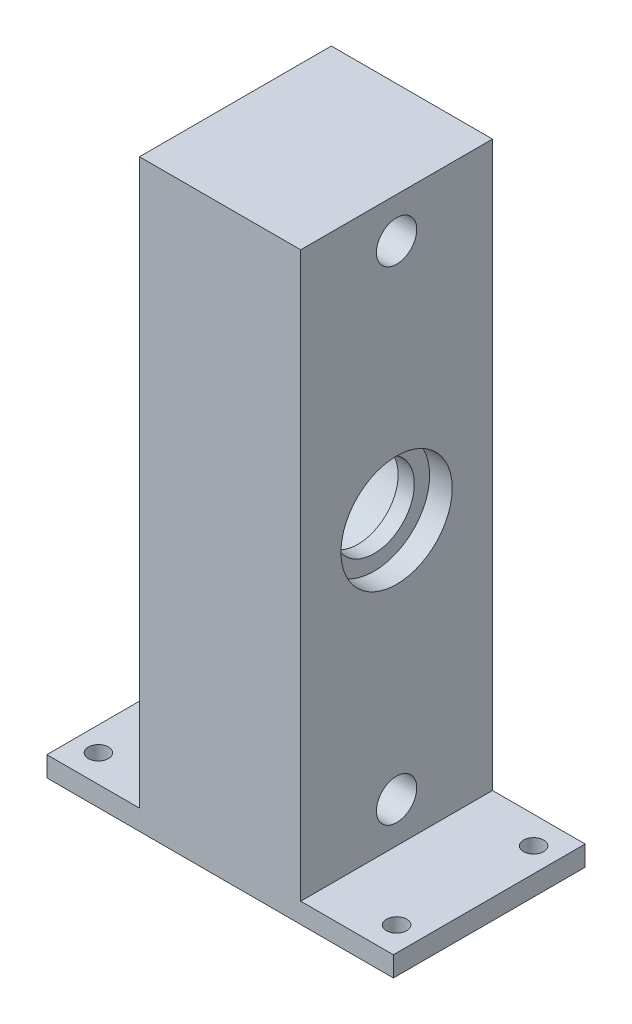
ISO-10303-21;
HEADER;
FILE_DESCRIPTION(('STEP AP214'),'2;1');
FILE_NAME('part.step','',(''),(''),'','','');
FILE_SCHEMA(('AUTOMOTIVE_DESIGN { 1 0 10303 214 1 1 1 1 }'));
ENDSEC;
DATA;
#1=APPLICATION_CONTEXT('core data for automotive mechanical design processes');
#2=APPLICATION_PROTOCOL_DEFINITION('international standard','automotive_design',2000,#1);
#3=PRODUCT_CONTEXT('',#1,'mechanical');
#4=PRODUCT('Part','Part','',(#3));
#5=PRODUCT_RELATED_PRODUCT_CATEGORY('part','',(#4));
#6=PRODUCT_DEFINITION_FORMATION('','',#4);
#7=PRODUCT_DEFINITION_CONTEXT('part definition',#1,'design');
#8=PRODUCT_DEFINITION('design','',#6,#7);
#9=PRODUCT_DEFINITION_SHAPE('','',#8);
#10=(LENGTH_UNIT() NAMED_UNIT(*) SI_UNIT(.MILLI.,.METRE.));
#11=(NAMED_UNIT(*) PLANE_ANGLE_UNIT() SI_UNIT($,.RADIAN.));
#12=(NAMED_UNIT(*) SI_UNIT($,.STERADIAN.) SOLID_ANGLE_UNIT());
#13=UNCERTAINTY_MEASURE_WITH_UNIT(LENGTH_MEASURE(1.E-05),#10,'distance_accuracy_value','');
#14=(GEOMETRIC_REPRESENTATION_CONTEXT(3) GLOBAL_UNCERTAINTY_ASSIGNED_CONTEXT((#13)) GLOBAL_UNIT_ASSIGNED_CONTEXT((#10,
#11,#12)) REPRESENTATION_CONTEXT('',''));
#15=CARTESIAN_POINT('',(0.,0.,0.));
#16=DIRECTION('',(0.,0.,1.));
#17=DIRECTION('',(1.,0.,0.));
#18=AXIS2_PLACEMENT_3D('',#15,#16,#17);
#19=CARTESIAN_POINT('',(-12.7,44.45,30.226));
#20=DIRECTION('',(1.,0.,0.));
#21=DIRECTION('',(0.,0.,-1.));
#22=AXIS2_PLACEMENT_3D('',#19,#20,#21);
#23=PLANE('',#22);
#24=CARTESIAN_POINT('',(-12.7,0.,15.113));
#25=DIRECTION('',(1.,0.,0.));
#26=DIRECTION('',(0.,0.,-1.));
#27=AXIS2_PLACEMENT_3D('',#24,#25,#26);
#28=CIRCLE('',#27,10.795);
#29=CARTESIAN_POINT('',(-12.7,0.,4.318));
#30=VERTEX_POINT('',#29);
#31=EDGE_CURVE('E142',#30,#30,#28,.T.);
#32=ORIENTED_EDGE('',*,*,#31,.T.);
#33=EDGE_LOOP('',(#32));
#34=FACE_BOUND('',#33,.T.);
#35=DIRECTION('',(0.,-1.,0.));
#36=VECTOR('',#35,1.);
#37=CARTESIAN_POINT('',(-12.7,44.45,0.));
#38=LINE('',#37,#36);
#39=CARTESIAN_POINT('',(-12.7,44.45,0.));
#40=VERTEX_POINT('',#39);
#41=CARTESIAN_POINT('',(-12.7,-44.45,0.));
#42=VERTEX_POINT('',#41);
#43=EDGE_CURVE('E165',#40,#42,#38,.T.);
#44=ORIENTED_EDGE('',*,*,#43,.T.);
#45=DIRECTION('',(0.,0.,-1.));
#46=VECTOR('',#45,1.);
#47=CARTESIAN_POINT('',(-12.7,-44.45,30.226));
#48=LINE('',#47,#46);
#49=CARTESIAN_POINT('',(-12.7,-44.45,30.226));
#50=VERTEX_POINT('',#49);
#51=EDGE_CURVE('E11',#50,#42,#48,.T.);
#52=ORIENTED_EDGE('',*,*,#51,.F.);
#53=DIRECTION('',(0.,-1.,0.));
#54=VECTOR('',#53,1.);
#55=CARTESIAN_POINT('',(-12.7,44.45,30.226));
#56=LINE('',#55,#54);
#57=CARTESIAN_POINT('',(-12.7,44.45,30.226));
#58=VERTEX_POINT('',#57);
#59=EDGE_CURVE('E81',#58,#50,#56,.T.);
#60=ORIENTED_EDGE('',*,*,#59,.F.);
#61=DIRECTION('',(0.,0.,-1.));
#62=VECTOR('',#61,1.);
#63=CARTESIAN_POINT('',(-12.7,44.45,30.226));
#64=LINE('',#63,#62);
#65=EDGE_CURVE('E184',#58,#40,#64,.T.);
#66=ORIENTED_EDGE('',*,*,#65,.T.);
#67=EDGE_LOOP('',(#44,#52,#60,#66));
#68=FACE_BOUND('',#67,.T.);
#69=ADVANCED_FACE('F39',(#34,#68),#23,.F.);
#70=CARTESIAN_POINT('',(12.7,44.45,30.226));
#71=DIRECTION('',(-1.,0.,0.));
#72=DIRECTION('',(0.,0.,1.));
#73=AXIS2_PLACEMENT_3D('',#70,#71,#72);
#74=PLANE('',#73);
#75=CARTESIAN_POINT('',(12.7,0.,15.113));
#76=DIRECTION('',(1.,0.,0.));
#77=DIRECTION('',(0.,0.,-1.));
#78=AXIS2_PLACEMENT_3D('',#75,#76,#77);
#79=CIRCLE('',#78,8.763);
#80=CARTESIAN_POINT('',(12.7,0.,6.35));
#81=VERTEX_POINT('',#80);
#82=EDGE_CURVE('E156',#81,#81,#79,.T.);
#83=ORIENTED_EDGE('',*,*,#82,.F.);
#84=EDGE_LOOP('',(#83));
#85=FACE_BOUND('',#84,.T.);
#86=CARTESIAN_POINT('',(12.7,38.1,15.113));
#87=DIRECTION('',(1.,0.,0.));
#88=DIRECTION('',(0.,0.,-1.));
#89=AXIS2_PLACEMENT_3D('',#86,#87,#88);
#90=CIRCLE('',#89,3.175);
#91=CARTESIAN_POINT('',(12.7,38.1,11.938));
#92=VERTEX_POINT('',#91);
#93=EDGE_CURVE('E166',#92,#92,#90,.T.);
#94=ORIENTED_EDGE('',*,*,#93,.F.);
#95=EDGE_LOOP('',(#94));
#96=FACE_BOUND('',#95,.T.);
#97=CARTESIAN_POINT('',(12.7,-38.1,15.113));
#98=DIRECTION('',(1.,0.,0.));
#99=DIRECTION('',(0.,0.,-1.));
#100=AXIS2_PLACEMENT_3D('',#97,#98,#99);
#101=CIRCLE('',#100,3.175);
#102=CARTESIAN_POINT('',(12.7,-38.1,11.938));
#103=VERTEX_POINT('',#102);
#104=EDGE_CURVE('E160',#103,#103,#101,.T.);
#105=ORIENTED_EDGE('',*,*,#104,.F.);
#106=EDGE_LOOP('',(#105));
#107=FACE_BOUND('',#106,.T.);
#108=DIRECTION('',(0.,1.,0.));
#109=VECTOR('',#108,1.);
#110=CARTESIAN_POINT('',(12.7,44.45,0.));
#111=LINE('',#110,#109);
#112=CARTESIAN_POINT('',(12.7,-44.45,0.));
#113=VERTEX_POINT('',#112);
#114=CARTESIAN_POINT('',(12.7,44.45,0.));
#115=VERTEX_POINT('',#114);
#116=EDGE_CURVE('E70',#113,#115,#111,.T.);
#117=ORIENTED_EDGE('',*,*,#116,.T.);
#118=DIRECTION('',(0.,0.,-1.));
#119=VECTOR('',#118,1.);
#120=CARTESIAN_POINT('',(12.7,44.45,30.226));
#121=LINE('',#120,#119);
#122=CARTESIAN_POINT('',(12.7,44.45,30.226));
#123=VERTEX_POINT('',#122);
#124=EDGE_CURVE('E193',#123,#115,#121,.T.);
#125=ORIENTED_EDGE('',*,*,#124,.F.);
#126=DIRECTION('',(0.,1.,0.));
#127=VECTOR('',#126,1.);
#128=CARTESIAN_POINT('',(12.7,44.45,30.226));
#129=LINE('',#128,#127);
#130=CARTESIAN_POINT('',(12.7,-44.45,30.226));
#131=VERTEX_POINT('',#130);
#132=EDGE_CURVE('E179',#131,#123,#129,.T.);
#133=ORIENTED_EDGE('',*,*,#132,.F.);
#134=DIRECTION('',(0.,0.,-1.));
#135=VECTOR('',#134,1.);
#136=CARTESIAN_POINT('',(12.7,-44.45,30.226));
#137=LINE('',#136,#135);
#138=EDGE_CURVE('E48',#131,#113,#137,.T.);
#139=ORIENTED_EDGE('',*,*,#138,.T.);
#140=EDGE_LOOP('',(#117,#125,#133,#139));
#141=FACE_BOUND('',#140,.T.);
#142=ADVANCED_FACE('F197',(#85,#96,#107,#141),#74,.F.);
#143=CARTESIAN_POINT('',(-12.7,44.45,30.226));
#144=DIRECTION('',(0.,-1.,0.));
#145=DIRECTION('',(0.,0.,-1.));
#146=AXIS2_PLACEMENT_3D('',#143,#144,#145);
#147=PLANE('',#146);
#148=DIRECTION('',(-1.,0.,0.));
#149=VECTOR('',#148,1.);
#150=CARTESIAN_POINT('',(-12.7,44.45,0.));
#151=LINE('',#150,#149);
#152=EDGE_CURVE('E76',#115,#40,#151,.T.);
#153=ORIENTED_EDGE('',*,*,#152,.T.);
#154=ORIENTED_EDGE('',*,*,#65,.F.);
#155=DIRECTION('',(-1.,0.,0.));
#156=VECTOR('',#155,1.);
#157=CARTESIAN_POINT('',(-12.7,44.45,30.226));
#158=LINE('',#157,#156);
#159=EDGE_CURVE('E56',#123,#58,#158,.T.);
#160=ORIENTED_EDGE('',*,*,#159,.F.);
#161=ORIENTED_EDGE('',*,*,#124,.T.);
#162=EDGE_LOOP('',(#153,#154,#160,#161));
#163=FACE_BOUND('',#162,.T.);
#164=ADVANCED_FACE('F297',(#163),#147,.F.);
#165=CARTESIAN_POINT('',(0.,0.,30.226));
#166=DIRECTION('',(0.,0.,1.));
#167=DIRECTION('',(1.,0.,0.));
#168=AXIS2_PLACEMENT_3D('',#165,#166,#167);
#169=PLANE('',#168);
#170=ORIENTED_EDGE('',*,*,#59,.T.);
#171=DIRECTION('',(-1.,0.,0.));
#172=VECTOR('',#171,1.);
#173=CARTESIAN_POINT('',(-27.305,-44.45,30.226));
#174=LINE('',#173,#172);
#175=CARTESIAN_POINT('',(-27.305,-44.45,30.226));
#176=VERTEX_POINT('',#175);
#177=EDGE_CURVE('E217',#50,#176,#174,.T.);
#178=ORIENTED_EDGE('',*,*,#177,.T.);
#179=DIRECTION('',(0.,1.,0.));
#180=VECTOR('',#179,1.);
#181=CARTESIAN_POINT('',(-27.305,-47.625,30.226));
#182=LINE('',#181,#180);
#183=CARTESIAN_POINT('',(-27.305,-47.625,30.226));
#184=VERTEX_POINT('',#183);
#185=EDGE_CURVE('E220',#184,#176,#182,.T.);
#186=ORIENTED_EDGE('',*,*,#185,.F.);
#187=DIRECTION('',(-1.,0.,0.));
#188=VECTOR('',#187,1.);
#189=CARTESIAN_POINT('',(-27.305,-47.625,30.226));
#190=LINE('',#189,#188);
#191=CARTESIAN_POINT('',(27.305,-47.625,30.226));
#192=VERTEX_POINT('',#191);
#193=EDGE_CURVE('E131',#192,#184,#190,.T.);
#194=ORIENTED_EDGE('',*,*,#193,.F.);
#195=DIRECTION('',(0.,1.,0.));
#196=VECTOR('',#195,1.);
#197=CARTESIAN_POINT('',(27.305,-47.625,30.226));
#198=LINE('',#197,#196);
#199=CARTESIAN_POINT('',(27.305,-44.45,30.226));
#200=VERTEX_POINT('',#199);
#201=EDGE_CURVE('E149',#192,#200,#198,.T.);
#202=ORIENTED_EDGE('',*,*,#201,.T.);
#203=EDGE_CURVE('E136',#200,#131,#174,.T.);
#204=ORIENTED_EDGE('',*,*,#203,.T.);
#205=ORIENTED_EDGE('',*,*,#132,.T.);
#206=ORIENTED_EDGE('',*,*,#159,.T.);
#207=EDGE_LOOP('',(#170,#178,#186,#194,#202,#204,#205,#206));
#208=FACE_BOUND('',#207,.T.);
#209=ADVANCED_FACE('F225',(#208),#169,.T.);
#210=CARTESIAN_POINT('',(0.,0.,0.));
#211=DIRECTION('',(0.,0.,1.));
#212=DIRECTION('',(1.,0.,0.));
#213=AXIS2_PLACEMENT_3D('',#210,#211,#212);
#214=PLANE('',#213);
#215=ORIENTED_EDGE('',*,*,#43,.F.);
#216=ORIENTED_EDGE('',*,*,#152,.F.);
#217=ORIENTED_EDGE('',*,*,#116,.F.);
#218=DIRECTION('',(1.,0.,0.));
#219=VECTOR('',#218,1.);
#220=CARTESIAN_POINT('',(-27.305,-44.45,0.));
#221=LINE('',#220,#219);
#222=CARTESIAN_POINT('',(27.305,-44.45,0.));
#223=VERTEX_POINT('',#222);
#224=EDGE_CURVE('E202',#113,#223,#221,.T.);
#225=ORIENTED_EDGE('',*,*,#224,.T.);
#226=DIRECTION('',(0.,1.,0.));
#227=VECTOR('',#226,1.);
#228=CARTESIAN_POINT('',(27.305,-47.625,0.));
#229=LINE('',#228,#227);
#230=CARTESIAN_POINT('',(27.305,-47.625,0.));
#231=VERTEX_POINT('',#230);
#232=EDGE_CURVE('E121',#231,#223,#229,.T.);
#233=ORIENTED_EDGE('',*,*,#232,.F.);
#234=DIRECTION('',(1.,0.,0.));
#235=VECTOR('',#234,1.);
#236=CARTESIAN_POINT('',(-27.305,-47.625,0.));
#237=LINE('',#236,#235);
#238=CARTESIAN_POINT('',(-27.305,-47.625,0.));
#239=VERTEX_POINT('',#238);
#240=EDGE_CURVE('E112',#239,#231,#237,.T.);
#241=ORIENTED_EDGE('',*,*,#240,.F.);
#242=DIRECTION('',(0.,1.,0.));
#243=VECTOR('',#242,1.);
#244=CARTESIAN_POINT('',(-27.305,-47.625,0.));
#245=LINE('',#244,#243);
#246=CARTESIAN_POINT('',(-27.305,-44.45,0.));
#247=VERTEX_POINT('',#246);
#248=EDGE_CURVE('E118',#239,#247,#245,.T.);
#249=ORIENTED_EDGE('',*,*,#248,.T.);
#250=EDGE_CURVE('E207',#247,#42,#221,.T.);
#251=ORIENTED_EDGE('',*,*,#250,.T.);
#252=EDGE_LOOP('',(#215,#216,#217,#225,#233,#241,#249,#251));
#253=FACE_BOUND('',#252,.T.);
#254=ADVANCED_FACE('F115',(#253),#214,.F.);
#255=CARTESIAN_POINT('',(0.,-38.1,15.113));
#256=DIRECTION('',(1.,0.,0.));
#257=DIRECTION('',(0.,0.,-1.));
#258=AXIS2_PLACEMENT_3D('',#255,#256,#257);
#259=CYLINDRICAL_SURFACE('',#258,3.175);
#260=CARTESIAN_POINT('',(0.,-38.1,15.113));
#261=DIRECTION('',(1.,0.,0.));
#262=DIRECTION('',(0.,0.,-1.));
#263=AXIS2_PLACEMENT_3D('',#260,#261,#262);
#264=CIRCLE('',#263,3.175);
#265=CARTESIAN_POINT('',(0.,-38.1,11.938));
#266=VERTEX_POINT('',#265);
#267=EDGE_CURVE('E170',#266,#266,#264,.T.);
#268=ORIENTED_EDGE('',*,*,#267,.F.);
#269=EDGE_LOOP('',(#268));
#270=FACE_BOUND('',#269,.T.);
#271=ORIENTED_EDGE('',*,*,#104,.T.);
#272=EDGE_LOOP('',(#271));
#273=FACE_BOUND('',#272,.T.);
#274=ADVANCED_FACE('F399',(#270,#273),#259,.F.);
#275=CARTESIAN_POINT('',(0.,-38.1,15.113));
#276=DIRECTION('',(1.,0.,0.));
#277=DIRECTION('',(0.,0.,-1.));
#278=AXIS2_PLACEMENT_3D('',#275,#276,#277);
#279=PLANE('',#278);
#280=ORIENTED_EDGE('',*,*,#267,.T.);
#281=EDGE_LOOP('',(#280));
#282=FACE_BOUND('',#281,.T.);
#283=ADVANCED_FACE('F452',(#282),#279,.T.);
#284=CARTESIAN_POINT('',(0.,38.1,15.113));
#285=DIRECTION('',(1.,0.,0.));
#286=DIRECTION('',(0.,0.,-1.));
#287=AXIS2_PLACEMENT_3D('',#284,#285,#286);
#288=CYLINDRICAL_SURFACE('',#287,3.175);
#289=CARTESIAN_POINT('',(0.,38.1,15.113));
#290=DIRECTION('',(1.,0.,0.));
#291=DIRECTION('',(0.,0.,-1.));
#292=AXIS2_PLACEMENT_3D('',#289,#290,#291);
#293=CIRCLE('',#292,3.175);
#294=CARTESIAN_POINT('',(0.,38.1,11.938));
#295=VERTEX_POINT('',#294);
#296=EDGE_CURVE('E161',#295,#295,#293,.T.);
#297=ORIENTED_EDGE('',*,*,#296,.F.);
#298=EDGE_LOOP('',(#297));
#299=FACE_BOUND('',#298,.T.);
#300=ORIENTED_EDGE('',*,*,#93,.T.);
#301=EDGE_LOOP('',(#300));
#302=FACE_BOUND('',#301,.T.);
#303=ADVANCED_FACE('F442',(#299,#302),#288,.F.);
#304=CARTESIAN_POINT('',(0.,38.1,15.113));
#305=DIRECTION('',(1.,0.,0.));
#306=DIRECTION('',(0.,0.,-1.));
#307=AXIS2_PLACEMENT_3D('',#304,#305,#306);
#308=PLANE('',#307);
#309=ORIENTED_EDGE('',*,*,#296,.T.);
#310=EDGE_LOOP('',(#309));
#311=FACE_BOUND('',#310,.T.);
#312=ADVANCED_FACE('F432',(#311),#308,.T.);
#313=CARTESIAN_POINT('',(9.14400000000001,0.,15.113));
#314=DIRECTION('',(1.,0.,0.));
#315=DIRECTION('',(0.,0.,-1.));
#316=AXIS2_PLACEMENT_3D('',#313,#314,#315);
#317=CYLINDRICAL_SURFACE('',#316,8.763);
#318=CARTESIAN_POINT('',(9.14400000000001,0.,15.113));
#319=DIRECTION('',(1.,0.,0.));
#320=DIRECTION('',(0.,0.,-1.));
#321=AXIS2_PLACEMENT_3D('',#318,#319,#320);
#322=CIRCLE('',#321,8.763);
#323=CARTESIAN_POINT('',(9.14400000000001,0.,6.35));
#324=VERTEX_POINT('',#323);
#325=EDGE_CURVE('E147',#324,#324,#322,.T.);
#326=ORIENTED_EDGE('',*,*,#325,.F.);
#327=EDGE_LOOP('',(#326));
#328=FACE_BOUND('',#327,.T.);
#329=ORIENTED_EDGE('',*,*,#82,.T.);
#330=EDGE_LOOP('',(#329));
#331=FACE_BOUND('',#330,.T.);
#332=ADVANCED_FACE('F314',(#328,#331),#317,.F.);
#333=CARTESIAN_POINT('',(-12.7,0.,15.113));
#334=DIRECTION('',(1.,0.,0.));
#335=DIRECTION('',(0.,0.,-1.));
#336=AXIS2_PLACEMENT_3D('',#333,#334,#335);
#337=CYLINDRICAL_SURFACE('',#336,10.795);
#338=CARTESIAN_POINT('',(6.60400000000001,0.,15.113));
#339=DIRECTION('',(-1.,0.,0.));
#340=DIRECTION('',(0.,0.,1.));
#341=AXIS2_PLACEMENT_3D('',#338,#339,#340);
#342=CIRCLE('',#341,10.795);
#343=CARTESIAN_POINT('',(6.60400000000001,0.,25.908));
#344=VERTEX_POINT('',#343);
#345=EDGE_CURVE('E245',#344,#344,#342,.T.);
#346=ORIENTED_EDGE('',*,*,#345,.F.);
#347=EDGE_LOOP('',(#346));
#348=FACE_BOUND('',#347,.T.);
#349=ORIENTED_EDGE('',*,*,#31,.F.);
#350=EDGE_LOOP('',(#349));
#351=FACE_BOUND('',#350,.T.);
#352=ADVANCED_FACE('F306',(#348,#351),#337,.F.);
#353=CARTESIAN_POINT('',(0.,-44.45,0.));
#354=DIRECTION('',(0.,-1.,0.));
#355=DIRECTION('',(0.,0.,-1.));
#356=AXIS2_PLACEMENT_3D('',#353,#354,#355);
#357=PLANE('',#356);
#358=CARTESIAN_POINT('',(-23.495,-44.45,4.31799999999999));
#359=DIRECTION('',(0.,-1.,0.));
#360=DIRECTION('',(0.,0.,-1.));
#361=AXIS2_PLACEMENT_3D('',#358,#359,#360);
#362=CIRCLE('',#361,1.5875);
#363=CARTESIAN_POINT('',(-23.495,-44.45,2.73049999999999));
#364=VERTEX_POINT('',#363);
#365=EDGE_CURVE('E236',#364,#364,#362,.T.);
#366=ORIENTED_EDGE('',*,*,#365,.T.);
#367=EDGE_LOOP('',(#366));
#368=FACE_BOUND('',#367,.T.);
#369=CARTESIAN_POINT('',(-23.495,-44.45,25.908));
#370=DIRECTION('',(0.,-1.,0.));
#371=DIRECTION('',(0.,0.,-1.));
#372=AXIS2_PLACEMENT_3D('',#369,#370,#371);
#373=CIRCLE('',#372,1.5875);
#374=CARTESIAN_POINT('',(-23.495,-44.45,24.3205));
#375=VERTEX_POINT('',#374);
#376=EDGE_CURVE('E211',#375,#375,#373,.T.);
#377=ORIENTED_EDGE('',*,*,#376,.T.);
#378=EDGE_LOOP('',(#377));
#379=FACE_BOUND('',#378,.T.);
#380=ORIENTED_EDGE('',*,*,#177,.F.);
#381=ORIENTED_EDGE('',*,*,#51,.T.);
#382=ORIENTED_EDGE('',*,*,#250,.F.);
#383=DIRECTION('',(0.,0.,-1.));
#384=VECTOR('',#383,1.);
#385=CARTESIAN_POINT('',(-27.305,-44.45,30.226));
#386=LINE('',#385,#384);
#387=EDGE_CURVE('E140',#176,#247,#386,.T.);
#388=ORIENTED_EDGE('',*,*,#387,.F.);
#389=EDGE_LOOP('',(#380,#381,#382,#388));
#390=FACE_BOUND('',#389,.T.);
#391=ADVANCED_FACE('F303',(#368,#379,#390),#357,.F.);
#392=CARTESIAN_POINT('',(-27.305,-47.625,30.226));
#393=DIRECTION('',(1.,0.,0.));
#394=DIRECTION('',(0.,0.,-1.));
#395=AXIS2_PLACEMENT_3D('',#392,#393,#394);
#396=PLANE('',#395);
#397=ORIENTED_EDGE('',*,*,#387,.T.);
#398=ORIENTED_EDGE('',*,*,#248,.F.);
#399=DIRECTION('',(0.,0.,-1.));
#400=VECTOR('',#399,1.);
#401=CARTESIAN_POINT('',(-27.305,-47.625,30.226));
#402=LINE('',#401,#400);
#403=EDGE_CURVE('E126',#184,#239,#402,.T.);
#404=ORIENTED_EDGE('',*,*,#403,.F.);
#405=ORIENTED_EDGE('',*,*,#185,.T.);
#406=EDGE_LOOP('',(#397,#398,#404,#405));
#407=FACE_BOUND('',#406,.T.);
#408=ADVANCED_FACE('F138',(#407),#396,.F.);
#409=CARTESIAN_POINT('',(27.305,-47.625,30.226));
#410=DIRECTION('',(-1.,0.,0.));
#411=DIRECTION('',(0.,0.,1.));
#412=AXIS2_PLACEMENT_3D('',#409,#410,#411);
#413=PLANE('',#412);
#414=DIRECTION('',(0.,0.,1.));
#415=VECTOR('',#414,1.);
#416=CARTESIAN_POINT('',(27.305,-44.45,30.226));
#417=LINE('',#416,#415);
#418=EDGE_CURVE('E205',#223,#200,#417,.T.);
#419=ORIENTED_EDGE('',*,*,#418,.T.);
#420=ORIENTED_EDGE('',*,*,#201,.F.);
#421=DIRECTION('',(0.,0.,1.));
#422=VECTOR('',#421,1.);
#423=CARTESIAN_POINT('',(27.305,-47.625,30.226));
#424=LINE('',#423,#422);
#425=EDGE_CURVE('E125',#231,#192,#424,.T.);
#426=ORIENTED_EDGE('',*,*,#425,.F.);
#427=ORIENTED_EDGE('',*,*,#232,.T.);
#428=EDGE_LOOP('',(#419,#420,#426,#427));
#429=FACE_BOUND('',#428,.T.);
#430=ADVANCED_FACE('F227',(#429),#413,.F.);
#431=CARTESIAN_POINT('',(0.,-47.625,0.));
#432=DIRECTION('',(0.,-1.,0.));
#433=DIRECTION('',(0.,0.,-1.));
#434=AXIS2_PLACEMENT_3D('',#431,#432,#433);
#435=PLANE('',#434);
#436=CARTESIAN_POINT('',(23.495,-47.625,25.908));
#437=DIRECTION('',(0.,-1.,0.));
#438=DIRECTION('',(0.,0.,-1.));
#439=AXIS2_PLACEMENT_3D('',#436,#437,#438);
#440=CIRCLE('',#439,1.5875);
#441=CARTESIAN_POINT('',(23.495,-47.625,24.3205));
#442=VERTEX_POINT('',#441);
#443=EDGE_CURVE('E240',#442,#442,#440,.T.);
#444=ORIENTED_EDGE('',*,*,#443,.F.);
#445=EDGE_LOOP('',(#444));
#446=FACE_BOUND('',#445,.T.);
#447=CARTESIAN_POINT('',(23.495,-47.625,4.31799999999999));
#448=DIRECTION('',(0.,-1.,0.));
#449=DIRECTION('',(0.,0.,-1.));
#450=AXIS2_PLACEMENT_3D('',#447,#448,#449);
#451=CIRCLE('',#450,1.5875);
#452=CARTESIAN_POINT('',(23.495,-47.625,2.73049999999999));
#453=VERTEX_POINT('',#452);
#454=EDGE_CURVE('E249',#453,#453,#451,.T.);
#455=ORIENTED_EDGE('',*,*,#454,.F.);
#456=EDGE_LOOP('',(#455));
#457=FACE_BOUND('',#456,.T.);
#458=CARTESIAN_POINT('',(-23.495,-47.625,4.31799999999999));
#459=DIRECTION('',(0.,-1.,0.));
#460=DIRECTION('',(0.,0.,-1.));
#461=AXIS2_PLACEMENT_3D('',#458,#459,#460);
#462=CIRCLE('',#461,1.5875);
#463=CARTESIAN_POINT('',(-23.495,-47.625,2.73049999999999));
#464=VERTEX_POINT('',#463);
#465=EDGE_CURVE('E257',#464,#464,#462,.T.);
#466=ORIENTED_EDGE('',*,*,#465,.F.);
#467=EDGE_LOOP('',(#466));
#468=FACE_BOUND('',#467,.T.);
#469=CARTESIAN_POINT('',(-23.495,-47.625,25.908));
#470=DIRECTION('',(0.,-1.,0.));
#471=DIRECTION('',(0.,0.,-1.));
#472=AXIS2_PLACEMENT_3D('',#469,#470,#471);
#473=CIRCLE('',#472,1.5875);
#474=CARTESIAN_POINT('',(-23.495,-47.625,24.3205));
#475=VERTEX_POINT('',#474);
#476=EDGE_CURVE('E232',#475,#475,#473,.T.);
#477=ORIENTED_EDGE('',*,*,#476,.F.);
#478=EDGE_LOOP('',(#477));
#479=FACE_BOUND('',#478,.T.);
#480=ORIENTED_EDGE('',*,*,#403,.T.);
#481=ORIENTED_EDGE('',*,*,#240,.T.);
#482=ORIENTED_EDGE('',*,*,#425,.T.);
#483=ORIENTED_EDGE('',*,*,#193,.T.);
#484=EDGE_LOOP('',(#480,#481,#482,#483));
#485=FACE_BOUND('',#484,.T.);
#486=ADVANCED_FACE('F129',(#446,#457,#468,#479,#485),#435,.T.);
#487=CARTESIAN_POINT('',(23.495,-44.45,25.908));
#488=DIRECTION('',(0.,-1.,0.));
#489=DIRECTION('',(0.,0.,-1.));
#490=AXIS2_PLACEMENT_3D('',#487,#488,#489);
#491=CIRCLE('',#490,1.5875);
#492=CARTESIAN_POINT('',(23.495,-44.45,24.3205));
#493=VERTEX_POINT('',#492);
#494=EDGE_CURVE('E244',#493,#493,#491,.T.);
#495=ORIENTED_EDGE('',*,*,#494,.T.);
#496=EDGE_LOOP('',(#495));
#497=FACE_BOUND('',#496,.T.);
#498=CARTESIAN_POINT('',(23.495,-44.45,4.31799999999999));
#499=DIRECTION('',(0.,-1.,0.));
#500=DIRECTION('',(0.,0.,-1.));
#501=AXIS2_PLACEMENT_3D('',#498,#499,#500);
#502=CIRCLE('',#501,1.5875);
#503=CARTESIAN_POINT('',(23.495,-44.45,2.73049999999999));
#504=VERTEX_POINT('',#503);
#505=EDGE_CURVE('E253',#504,#504,#502,.T.);
#506=ORIENTED_EDGE('',*,*,#505,.T.);
#507=EDGE_LOOP('',(#506));
#508=FACE_BOUND('',#507,.T.);
#509=ORIENTED_EDGE('',*,*,#138,.F.);
#510=ORIENTED_EDGE('',*,*,#203,.F.);
#511=ORIENTED_EDGE('',*,*,#418,.F.);
#512=ORIENTED_EDGE('',*,*,#224,.F.);
#513=EDGE_LOOP('',(#509,#510,#511,#512));
#514=FACE_BOUND('',#513,.T.);
#515=ADVANCED_FACE('F204',(#497,#508,#514),#357,.F.);
#516=CARTESIAN_POINT('',(23.495,-44.45,4.31799999999999));
#517=DIRECTION('',(0.,-1.,0.));
#518=DIRECTION('',(0.,0.,-1.));
#519=AXIS2_PLACEMENT_3D('',#516,#517,#518);
#520=CYLINDRICAL_SURFACE('',#519,1.5875);
#521=ORIENTED_EDGE('',*,*,#505,.F.);
#522=EDGE_LOOP('',(#521));
#523=FACE_BOUND('',#522,.T.);
#524=ORIENTED_EDGE('',*,*,#454,.T.);
#525=EDGE_LOOP('',(#524));
#526=FACE_BOUND('',#525,.T.);
#527=ADVANCED_FACE('F321',(#523,#526),#520,.F.);
#528=CARTESIAN_POINT('',(23.495,-44.45,25.908));
#529=DIRECTION('',(0.,-1.,0.));
#530=DIRECTION('',(0.,0.,-1.));
#531=AXIS2_PLACEMENT_3D('',#528,#529,#530);
#532=CYLINDRICAL_SURFACE('',#531,1.5875);
#533=ORIENTED_EDGE('',*,*,#494,.F.);
#534=EDGE_LOOP('',(#533));
#535=FACE_BOUND('',#534,.T.);
#536=ORIENTED_EDGE('',*,*,#443,.T.);
#537=EDGE_LOOP('',(#536));
#538=FACE_BOUND('',#537,.T.);
#539=ADVANCED_FACE('F327',(#535,#538),#532,.F.);
#540=CARTESIAN_POINT('',(-23.495,-44.45,25.908));
#541=DIRECTION('',(0.,-1.,0.));
#542=DIRECTION('',(0.,0.,-1.));
#543=AXIS2_PLACEMENT_3D('',#540,#541,#542);
#544=CYLINDRICAL_SURFACE('',#543,1.5875);
#545=ORIENTED_EDGE('',*,*,#376,.F.);
#546=EDGE_LOOP('',(#545));
#547=FACE_BOUND('',#546,.T.);
#548=ORIENTED_EDGE('',*,*,#476,.T.);
#549=EDGE_LOOP('',(#548));
#550=FACE_BOUND('',#549,.T.);
#551=ADVANCED_FACE('F342',(#547,#550),#544,.F.);
#552=CARTESIAN_POINT('',(-23.495,-44.45,4.31799999999999));
#553=DIRECTION('',(0.,-1.,0.));
#554=DIRECTION('',(0.,0.,-1.));
#555=AXIS2_PLACEMENT_3D('',#552,#553,#554);
#556=CYLINDRICAL_SURFACE('',#555,1.5875);
#557=ORIENTED_EDGE('',*,*,#365,.F.);
#558=EDGE_LOOP('',(#557));
#559=FACE_BOUND('',#558,.T.);
#560=ORIENTED_EDGE('',*,*,#465,.T.);
#561=EDGE_LOOP('',(#560));
#562=FACE_BOUND('',#561,.T.);
#563=ADVANCED_FACE('F289',(#559,#562),#556,.F.);
#564=CARTESIAN_POINT('',(9.14400000000001,0.,15.113));
#565=DIRECTION('',(-1.,0.,0.));
#566=DIRECTION('',(0.,0.,1.));
#567=AXIS2_PLACEMENT_3D('',#564,#565,#566);
#568=PLANE('',#567);
#569=CARTESIAN_POINT('',(9.14400000000001,0.,15.113));
#570=DIRECTION('',(-1.,0.,0.));
#571=DIRECTION('',(0.,0.,1.));
#572=AXIS2_PLACEMENT_3D('',#569,#570,#571);
#573=CIRCLE('',#572,6.35);
#574=CARTESIAN_POINT('',(9.14400000000001,0.,21.463));
#575=VERTEX_POINT('',#574);
#576=EDGE_CURVE('E268',#575,#575,#573,.T.);
#577=ORIENTED_EDGE('',*,*,#576,.T.);
#578=EDGE_LOOP('',(#577));
#579=FACE_BOUND('',#578,.T.);
#580=ORIENTED_EDGE('',*,*,#325,.T.);
#581=EDGE_LOOP('',(#580));
#582=FACE_BOUND('',#581,.T.);
#583=ADVANCED_FACE('F281',(#579,#582),#568,.F.);
#584=CARTESIAN_POINT('',(6.60400000000001,0.,15.113));
#585=DIRECTION('',(-1.,0.,0.));
#586=DIRECTION('',(0.,0.,1.));
#587=AXIS2_PLACEMENT_3D('',#584,#585,#586);
#588=PLANE('',#587);
#589=ORIENTED_EDGE('',*,*,#345,.T.);
#590=EDGE_LOOP('',(#589));
#591=FACE_BOUND('',#590,.T.);
#592=CARTESIAN_POINT('',(6.60400000000001,0.,15.113));
#593=DIRECTION('',(-1.,0.,0.));
#594=DIRECTION('',(0.,0.,1.));
#595=AXIS2_PLACEMENT_3D('',#592,#593,#594);
#596=CIRCLE('',#595,6.35);
#597=CARTESIAN_POINT('',(6.60400000000001,0.,21.463));
#598=VERTEX_POINT('',#597);
#599=EDGE_CURVE('E267',#598,#598,#596,.T.);
#600=ORIENTED_EDGE('',*,*,#599,.F.);
#601=EDGE_LOOP('',(#600));
#602=FACE_BOUND('',#601,.T.);
#603=ADVANCED_FACE('F279',(#591,#602),#588,.T.);
#604=CARTESIAN_POINT('',(6.60400000000001,0.,15.113));
#605=DIRECTION('',(1.,0.,0.));
#606=DIRECTION('',(0.,0.,-1.));
#607=AXIS2_PLACEMENT_3D('',#604,#605,#606);
#608=CYLINDRICAL_SURFACE('',#607,6.35);
#609=ORIENTED_EDGE('',*,*,#599,.T.);
#610=EDGE_LOOP('',(#609));
#611=FACE_BOUND('',#610,.T.);
#612=ORIENTED_EDGE('',*,*,#576,.F.);
#613=EDGE_LOOP('',(#612));
#614=FACE_BOUND('',#613,.T.);
#615=ADVANCED_FACE('F276',(#611,#614),#608,.F.);
#616=CLOSED_SHELL('',(#69,#142,#164,#209,#254,#274,#283,#303,#312,#332,#352,#391,#408,#430,#486,
#515,#527,#539,#551,#563,#583,#603,#615));
#617=MANIFOLD_SOLID_BREP('B2',#616);
#618=ADVANCED_BREP_SHAPE_REPRESENTATION('',(#18,#617),#14);
#619=SHAPE_DEFINITION_REPRESENTATION(#9,#618);
ENDSEC;
END-ISO-10303-21;
